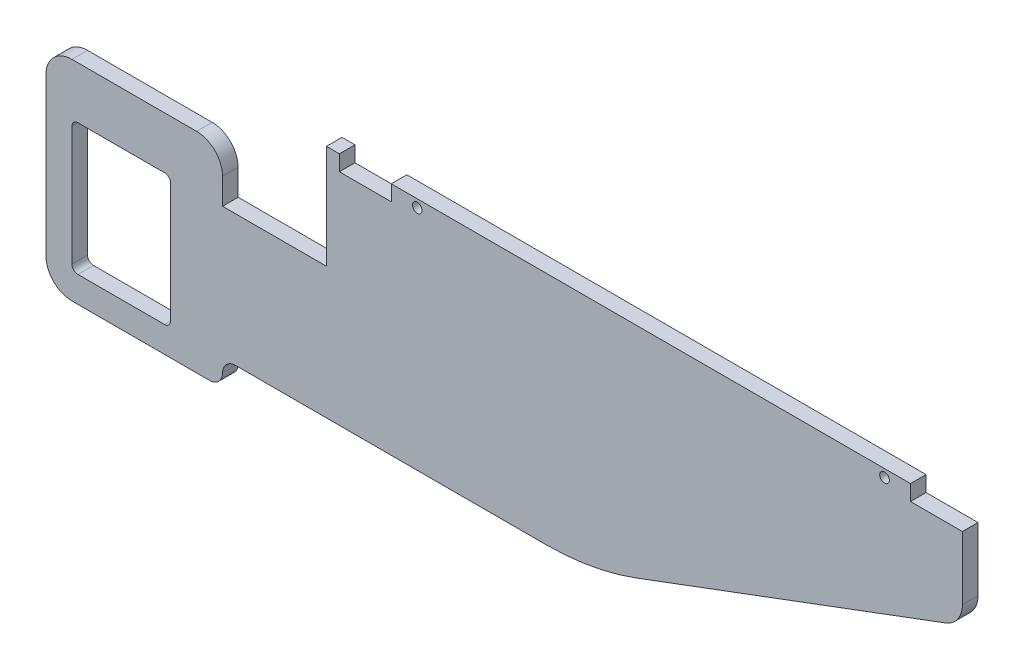
ISO-10303-21;
HEADER;
FILE_DESCRIPTION(('STEP AP214'),'2;1');
FILE_NAME('part.step','',(''),(''),'','','');
FILE_SCHEMA(('AUTOMOTIVE_DESIGN { 1 0 10303 214 1 1 1 1 }'));
ENDSEC;
DATA;
#1=APPLICATION_CONTEXT('core data for automotive mechanical design processes');
#2=APPLICATION_PROTOCOL_DEFINITION('international standard','automotive_design',2000,#1);
#3=PRODUCT_CONTEXT('',#1,'mechanical');
#4=PRODUCT('Part','Part','',(#3));
#5=PRODUCT_RELATED_PRODUCT_CATEGORY('part','',(#4));
#6=PRODUCT_DEFINITION_FORMATION('','',#4);
#7=PRODUCT_DEFINITION_CONTEXT('part definition',#1,'design');
#8=PRODUCT_DEFINITION('design','',#6,#7);
#9=PRODUCT_DEFINITION_SHAPE('','',#8);
#10=(LENGTH_UNIT() NAMED_UNIT(*) SI_UNIT(.MILLI.,.METRE.));
#11=(NAMED_UNIT(*) PLANE_ANGLE_UNIT() SI_UNIT($,.RADIAN.));
#12=(NAMED_UNIT(*) SI_UNIT($,.STERADIAN.) SOLID_ANGLE_UNIT());
#13=UNCERTAINTY_MEASURE_WITH_UNIT(LENGTH_MEASURE(1.E-05),#10,'distance_accuracy_value','');
#14=(GEOMETRIC_REPRESENTATION_CONTEXT(3) GLOBAL_UNCERTAINTY_ASSIGNED_CONTEXT((#13)) GLOBAL_UNIT_ASSIGNED_CONTEXT((#10,
#11,#12)) REPRESENTATION_CONTEXT('',''));
#15=CARTESIAN_POINT('',(0.,0.,0.));
#16=DIRECTION('',(0.,0.,1.));
#17=DIRECTION('',(1.,0.,0.));
#18=AXIS2_PLACEMENT_3D('',#15,#16,#17);
#19=CARTESIAN_POINT('',(323.,84.6,6.));
#20=DIRECTION('',(0.,0.,-1.));
#21=DIRECTION('',(-1.,0.,0.));
#22=AXIS2_PLACEMENT_3D('',#19,#20,#21);
#23=PLANE('',#22);
#24=CARTESIAN_POINT('',(133.,87.6,6.));
#25=DIRECTION('',(0.,0.,1.));
#26=DIRECTION('',(1.,0.,0.));
#27=AXIS2_PLACEMENT_3D('',#24,#25,#26);
#28=CIRCLE('',#27,1.85999999999999);
#29=CARTESIAN_POINT('',(134.86,87.6,6.));
#30=VERTEX_POINT('',#29);
#31=EDGE_CURVE('E306',#30,#30,#28,.T.);
#32=ORIENTED_EDGE('',*,*,#31,.F.);
#33=EDGE_LOOP('',(#32));
#34=FACE_BOUND('',#33,.T.);
#35=DIRECTION('',(1.,0.,0.));
#36=VECTOR('',#35,1.);
#37=CARTESIAN_POINT('',(58.,0.,6.));
#38=LINE('',#37,#36);
#39=CARTESIAN_POINT('',(63.,0.,6.));
#40=VERTEX_POINT('',#39);
#41=CARTESIAN_POINT('',(182.508323938548,0.,6.));
#42=VERTEX_POINT('',#41);
#43=EDGE_CURVE('E348',#40,#42,#38,.T.);
#44=ORIENTED_EDGE('',*,*,#43,.T.);
#45=CARTESIAN_POINT('',(182.508323938548,100.,6.));
#46=DIRECTION('',(0.,0.,-1.));
#47=DIRECTION('',(-1.,0.,0.));
#48=AXIS2_PLACEMENT_3D('',#45,#46,#47);
#49=CIRCLE('',#48,100.);
#50=CARTESIAN_POINT('',(217.544898349511,6.33870354546107,6.));
#51=VERTEX_POINT('',#50);
#52=EDGE_CURVE('E11',#42,#51,#49,.F.);
#53=ORIENTED_EDGE('',*,*,#52,.T.);
#54=DIRECTION('',(0.93661296454539,0.350365744109633,0.));
#55=VECTOR('',#54,1.);
#56=CARTESIAN_POINT('',(200.6,0.,6.));
#57=LINE('',#56,#55);
#58=CARTESIAN_POINT('',(336.503657441096,50.8384870475096,6.));
#59=VERTEX_POINT('',#58);
#60=EDGE_CURVE('E350',#51,#59,#57,.T.);
#61=ORIENTED_EDGE('',*,*,#60,.T.);
#62=CARTESIAN_POINT('',(333.,60.2046166929635,6.));
#63=DIRECTION('',(0.,0.,-1.));
#64=DIRECTION('',(-1.,0.,0.));
#65=AXIS2_PLACEMENT_3D('',#62,#63,#64);
#66=CIRCLE('',#65,10.);
#67=CARTESIAN_POINT('',(343.,60.2046166929635,6.));
#68=VERTEX_POINT('',#67);
#69=EDGE_CURVE('E443',#59,#68,#66,.F.);
#70=ORIENTED_EDGE('',*,*,#69,.T.);
#71=DIRECTION('',(0.,1.,0.));
#72=VECTOR('',#71,1.);
#73=CARTESIAN_POINT('',(343.,84.5999999999999,6.));
#74=LINE('',#73,#72);
#75=CARTESIAN_POINT('',(343.,84.5999999999999,6.));
#76=VERTEX_POINT('',#75);
#77=EDGE_CURVE('E352',#68,#76,#74,.T.);
#78=ORIENTED_EDGE('',*,*,#77,.T.);
#79=DIRECTION('',(-1.,0.,0.));
#80=VECTOR('',#79,1.);
#81=CARTESIAN_POINT('',(343.,84.5999999999999,6.));
#82=LINE('',#81,#80);
#83=CARTESIAN_POINT('',(323.,84.6,6.));
#84=VERTEX_POINT('',#83);
#85=EDGE_CURVE('E354',#76,#84,#82,.T.);
#86=ORIENTED_EDGE('',*,*,#85,.T.);
#87=DIRECTION('',(0.,1.,0.));
#88=VECTOR('',#87,1.);
#89=CARTESIAN_POINT('',(323.,90.6,6.));
#90=LINE('',#89,#88);
#91=CARTESIAN_POINT('',(323.,90.6,6.));
#92=VERTEX_POINT('',#91);
#93=EDGE_CURVE('E318',#84,#92,#90,.T.);
#94=ORIENTED_EDGE('',*,*,#93,.T.);
#95=DIRECTION('',(-1.,0.,0.));
#96=VECTOR('',#95,1.);
#97=CARTESIAN_POINT('',(123.,90.6,6.));
#98=LINE('',#97,#96);
#99=CARTESIAN_POINT('',(123.,90.6,6.));
#100=VERTEX_POINT('',#99);
#101=EDGE_CURVE('E321',#92,#100,#98,.T.);
#102=ORIENTED_EDGE('',*,*,#101,.T.);
#103=DIRECTION('',(0.,-1.,0.));
#104=VECTOR('',#103,1.);
#105=CARTESIAN_POINT('',(123.,90.6,6.));
#106=LINE('',#105,#104);
#107=CARTESIAN_POINT('',(123.,84.5999999999999,6.));
#108=VERTEX_POINT('',#107);
#109=EDGE_CURVE('E324',#100,#108,#106,.T.);
#110=ORIENTED_EDGE('',*,*,#109,.T.);
#111=DIRECTION('',(-1.,0.,0.));
#112=VECTOR('',#111,1.);
#113=CARTESIAN_POINT('',(103.,84.5999999999999,6.));
#114=LINE('',#113,#112);
#115=CARTESIAN_POINT('',(103.,84.5999999999999,6.));
#116=VERTEX_POINT('',#115);
#117=EDGE_CURVE('E326',#108,#116,#114,.T.);
#118=ORIENTED_EDGE('',*,*,#117,.T.);
#119=DIRECTION('',(0.,1.,0.));
#120=VECTOR('',#119,1.);
#121=CARTESIAN_POINT('',(103.,90.6,6.));
#122=LINE('',#121,#120);
#123=CARTESIAN_POINT('',(103.,90.6,6.));
#124=VERTEX_POINT('',#123);
#125=EDGE_CURVE('E328',#116,#124,#122,.T.);
#126=ORIENTED_EDGE('',*,*,#125,.T.);
#127=DIRECTION('',(-1.,0.,0.));
#128=VECTOR('',#127,1.);
#129=CARTESIAN_POINT('',(98.,90.6,6.));
#130=LINE('',#129,#128);
#131=CARTESIAN_POINT('',(98.,90.6,6.));
#132=VERTEX_POINT('',#131);
#133=EDGE_CURVE('E330',#124,#132,#130,.T.);
#134=ORIENTED_EDGE('',*,*,#133,.T.);
#135=DIRECTION('',(0.,-1.,0.));
#136=VECTOR('',#135,1.);
#137=CARTESIAN_POINT('',(98.,90.6,6.));
#138=LINE('',#137,#136);
#139=CARTESIAN_POINT('',(98.,50.6,6.));
#140=VERTEX_POINT('',#139);
#141=EDGE_CURVE('E332',#132,#140,#138,.T.);
#142=ORIENTED_EDGE('',*,*,#141,.T.);
#143=DIRECTION('',(-1.,0.,0.));
#144=VECTOR('',#143,1.);
#145=CARTESIAN_POINT('',(58.,50.6,6.));
#146=LINE('',#145,#144);
#147=CARTESIAN_POINT('',(58.,50.6,6.));
#148=VERTEX_POINT('',#147);
#149=EDGE_CURVE('E334',#140,#148,#146,.T.);
#150=ORIENTED_EDGE('',*,*,#149,.T.);
#151=DIRECTION('',(0.,1.,0.));
#152=VECTOR('',#151,1.);
#153=CARTESIAN_POINT('',(58.,58.4408840872774,6.));
#154=LINE('',#153,#152);
#155=CARTESIAN_POINT('',(58.,60.6,6.));
#156=VERTEX_POINT('',#155);
#157=EDGE_CURVE('E336',#148,#156,#154,.T.);
#158=ORIENTED_EDGE('',*,*,#157,.T.);
#159=CARTESIAN_POINT('',(48.,60.6,6.));
#160=DIRECTION('',(0.,0.,-1.));
#161=DIRECTION('',(-1.,0.,0.));
#162=AXIS2_PLACEMENT_3D('',#159,#160,#161);
#163=CIRCLE('',#162,10.);
#164=CARTESIAN_POINT('',(48.,70.6,6.));
#165=VERTEX_POINT('',#164);
#166=EDGE_CURVE('E437',#156,#165,#163,.F.);
#167=ORIENTED_EDGE('',*,*,#166,.T.);
#168=DIRECTION('',(-1.,0.,0.));
#169=VECTOR('',#168,1.);
#170=CARTESIAN_POINT('',(-10.,70.6,6.));
#171=LINE('',#170,#169);
#172=CARTESIAN_POINT('',(0.,70.6,6.));
#173=VERTEX_POINT('',#172);
#174=EDGE_CURVE('E339',#165,#173,#171,.T.);
#175=ORIENTED_EDGE('',*,*,#174,.T.);
#176=CARTESIAN_POINT('',(0.,60.6,6.));
#177=DIRECTION('',(0.,0.,-1.));
#178=DIRECTION('',(-1.,0.,0.));
#179=AXIS2_PLACEMENT_3D('',#176,#177,#178);
#180=CIRCLE('',#179,10.);
#181=CARTESIAN_POINT('',(-10.,60.6,6.));
#182=VERTEX_POINT('',#181);
#183=EDGE_CURVE('E441',#173,#182,#180,.F.);
#184=ORIENTED_EDGE('',*,*,#183,.T.);
#185=DIRECTION('',(0.,-1.,0.));
#186=VECTOR('',#185,1.);
#187=CARTESIAN_POINT('',(-10.,70.6,6.));
#188=LINE('',#187,#186);
#189=CARTESIAN_POINT('',(-9.99999999999999,0.,6.));
#190=VERTEX_POINT('',#189);
#191=EDGE_CURVE('E342',#182,#190,#188,.T.);
#192=ORIENTED_EDGE('',*,*,#191,.T.);
#193=CARTESIAN_POINT('',(0.,0.,6.));
#194=DIRECTION('',(0.,0.,-1.));
#195=DIRECTION('',(-1.,0.,0.));
#196=AXIS2_PLACEMENT_3D('',#193,#194,#195);
#197=CIRCLE('',#196,10.);
#198=CARTESIAN_POINT('',(0.,-10.,6.));
#199=VERTEX_POINT('',#198);
#200=EDGE_CURVE('E439',#190,#199,#197,.F.);
#201=ORIENTED_EDGE('',*,*,#200,.T.);
#202=DIRECTION('',(1.,0.,0.));
#203=VECTOR('',#202,1.);
#204=CARTESIAN_POINT('',(-9.99999999999999,-10.,6.));
#205=LINE('',#204,#203);
#206=CARTESIAN_POINT('',(53.,-10.,6.));
#207=VERTEX_POINT('',#206);
#208=EDGE_CURVE('E345',#199,#207,#205,.T.);
#209=ORIENTED_EDGE('',*,*,#208,.T.);
#210=CARTESIAN_POINT('',(53.,-5.,6.));
#211=DIRECTION('',(0.,0.,-1.));
#212=DIRECTION('',(-1.,0.,0.));
#213=AXIS2_PLACEMENT_3D('',#210,#211,#212);
#214=CIRCLE('',#213,5.);
#215=CARTESIAN_POINT('',(58.,-5.,6.));
#216=VERTEX_POINT('',#215);
#217=EDGE_CURVE('E467',#207,#216,#214,.F.);
#218=ORIENTED_EDGE('',*,*,#217,.T.);
#219=CARTESIAN_POINT('',(63.,-5.,6.));
#220=DIRECTION('',(0.,0.,-1.));
#221=DIRECTION('',(-1.,0.,0.));
#222=AXIS2_PLACEMENT_3D('',#219,#220,#221);
#223=CIRCLE('',#222,5.);
#224=EDGE_CURVE('E471',#216,#40,#223,.T.);
#225=ORIENTED_EDGE('',*,*,#224,.T.);
#226=EDGE_LOOP('',(#44,#53,#61,#70,#78,#86,#94,#102,#110,#118,#126,#134,#142,#150,#158,#167,
#175,#184,#192,#201,#209,#218,#225));
#227=FACE_BOUND('',#226,.T.);
#228=CARTESIAN_POINT('',(313.,87.6,6.));
#229=DIRECTION('',(0.,0.,1.));
#230=DIRECTION('',(1.,0.,0.));
#231=AXIS2_PLACEMENT_3D('',#228,#229,#230);
#232=CIRCLE('',#231,1.85999999999996);
#233=CARTESIAN_POINT('',(314.86,87.6,6.));
#234=VERTEX_POINT('',#233);
#235=EDGE_CURVE('E312',#234,#234,#232,.T.);
#236=ORIENTED_EDGE('',*,*,#235,.F.);
#237=EDGE_LOOP('',(#236));
#238=FACE_BOUND('',#237,.T.);
#239=CARTESIAN_POINT('',(2.3,48.3,6.));
#240=DIRECTION('',(0.,0.,1.));
#241=DIRECTION('',(1.,0.,0.));
#242=AXIS2_PLACEMENT_3D('',#239,#240,#241);
#243=CIRCLE('',#242,2.3);
#244=CARTESIAN_POINT('',(2.3,50.6,6.));
#245=VERTEX_POINT('',#244);
#246=CARTESIAN_POINT('',(0.,48.3,6.));
#247=VERTEX_POINT('',#246);
#248=EDGE_CURVE('E235',#245,#247,#243,.T.);
#249=ORIENTED_EDGE('',*,*,#248,.F.);
#250=DIRECTION('',(-1.,0.,0.));
#251=VECTOR('',#250,1.);
#252=CARTESIAN_POINT('',(2.3,50.6,6.));
#253=LINE('',#252,#251);
#254=CARTESIAN_POINT('',(35.7,50.6,6.));
#255=VERTEX_POINT('',#254);
#256=EDGE_CURVE('E271',#255,#245,#253,.T.);
#257=ORIENTED_EDGE('',*,*,#256,.F.);
#258=CARTESIAN_POINT('',(35.7,48.3,6.));
#259=DIRECTION('',(0.,0.,1.));
#260=DIRECTION('',(-1.,0.,0.));
#261=AXIS2_PLACEMENT_3D('',#258,#259,#260);
#262=CIRCLE('',#261,2.3);
#263=CARTESIAN_POINT('',(38.,48.3,6.));
#264=VERTEX_POINT('',#263);
#265=EDGE_CURVE('E268',#264,#255,#262,.T.);
#266=ORIENTED_EDGE('',*,*,#265,.F.);
#267=DIRECTION('',(0.,1.,0.));
#268=VECTOR('',#267,1.);
#269=CARTESIAN_POINT('',(38.,48.3,6.));
#270=LINE('',#269,#268);
#271=CARTESIAN_POINT('',(38.,2.3,6.));
#272=VERTEX_POINT('',#271);
#273=EDGE_CURVE('E266',#272,#264,#270,.T.);
#274=ORIENTED_EDGE('',*,*,#273,.F.);
#275=CARTESIAN_POINT('',(35.7,2.3,6.));
#276=DIRECTION('',(0.,0.,1.));
#277=DIRECTION('',(-1.,0.,0.));
#278=AXIS2_PLACEMENT_3D('',#275,#276,#277);
#279=CIRCLE('',#278,2.3);
#280=CARTESIAN_POINT('',(35.7,0.,6.));
#281=VERTEX_POINT('',#280);
#282=EDGE_CURVE('E264',#281,#272,#279,.T.);
#283=ORIENTED_EDGE('',*,*,#282,.F.);
#284=DIRECTION('',(1.,0.,0.));
#285=VECTOR('',#284,1.);
#286=CARTESIAN_POINT('',(2.30000000000001,0.,6.));
#287=LINE('',#286,#285);
#288=CARTESIAN_POINT('',(2.30000000000001,0.,6.));
#289=VERTEX_POINT('',#288);
#290=EDGE_CURVE('E260',#289,#281,#287,.T.);
#291=ORIENTED_EDGE('',*,*,#290,.F.);
#292=CARTESIAN_POINT('',(2.30000000000001,2.3,6.));
#293=DIRECTION('',(0.,0.,1.));
#294=DIRECTION('',(1.,0.,0.));
#295=AXIS2_PLACEMENT_3D('',#292,#293,#294);
#296=CIRCLE('',#295,2.3);
#297=CARTESIAN_POINT('',(0.,2.3,6.));
#298=VERTEX_POINT('',#297);
#299=EDGE_CURVE('E258',#298,#289,#296,.T.);
#300=ORIENTED_EDGE('',*,*,#299,.F.);
#301=DIRECTION('',(0.,-1.,0.));
#302=VECTOR('',#301,1.);
#303=CARTESIAN_POINT('',(0.,48.3,6.));
#304=LINE('',#303,#302);
#305=EDGE_CURVE('E245',#247,#298,#304,.T.);
#306=ORIENTED_EDGE('',*,*,#305,.F.);
#307=EDGE_LOOP('',(#249,#257,#266,#274,#283,#291,#300,#306));
#308=FACE_BOUND('',#307,.T.);
#309=ADVANCED_FACE('F31',(#34,#227,#238,#308),#23,.F.);
#310=CARTESIAN_POINT('',(323.,84.6,0.));
#311=DIRECTION('',(0.,0.,-1.));
#312=DIRECTION('',(-1.,0.,0.));
#313=AXIS2_PLACEMENT_3D('',#310,#311,#312);
#314=PLANE('',#313);
#315=CARTESIAN_POINT('',(133.,87.6,0.));
#316=DIRECTION('',(0.,0.,1.));
#317=DIRECTION('',(1.,0.,0.));
#318=AXIS2_PLACEMENT_3D('',#315,#316,#317);
#319=CIRCLE('',#318,1.85999999999999);
#320=CARTESIAN_POINT('',(134.86,87.6,0.));
#321=VERTEX_POINT('',#320);
#322=EDGE_CURVE('E253',#321,#321,#319,.T.);
#323=ORIENTED_EDGE('',*,*,#322,.T.);
#324=EDGE_LOOP('',(#323));
#325=FACE_BOUND('',#324,.T.);
#326=DIRECTION('',(0.93661296454539,0.350365744109633,0.));
#327=VECTOR('',#326,1.);
#328=CARTESIAN_POINT('',(200.6,0.,0.));
#329=LINE('',#328,#327);
#330=CARTESIAN_POINT('',(217.544898349511,6.33870354546107,0.));
#331=VERTEX_POINT('',#330);
#332=CARTESIAN_POINT('',(336.503657441096,50.8384870475096,0.));
#333=VERTEX_POINT('',#332);
#334=EDGE_CURVE('E388',#331,#333,#329,.T.);
#335=ORIENTED_EDGE('',*,*,#334,.F.);
#336=CARTESIAN_POINT('',(182.508323938548,100.,0.));
#337=DIRECTION('',(0.,0.,-1.));
#338=DIRECTION('',(-1.,0.,0.));
#339=AXIS2_PLACEMENT_3D('',#336,#337,#338);
#340=CIRCLE('',#339,100.);
#341=CARTESIAN_POINT('',(182.508323938548,0.,0.));
#342=VERTEX_POINT('',#341);
#343=EDGE_CURVE('E53',#331,#342,#340,.T.);
#344=ORIENTED_EDGE('',*,*,#343,.T.);
#345=DIRECTION('',(1.,0.,0.));
#346=VECTOR('',#345,1.);
#347=CARTESIAN_POINT('',(58.,0.,0.));
#348=LINE('',#347,#346);
#349=CARTESIAN_POINT('',(63.,0.,0.));
#350=VERTEX_POINT('',#349);
#351=EDGE_CURVE('E386',#350,#342,#348,.T.);
#352=ORIENTED_EDGE('',*,*,#351,.F.);
#353=CARTESIAN_POINT('',(63.,-5.,0.));
#354=DIRECTION('',(0.,0.,-1.));
#355=DIRECTION('',(-1.,0.,0.));
#356=AXIS2_PLACEMENT_3D('',#353,#354,#355);
#357=CIRCLE('',#356,5.);
#358=CARTESIAN_POINT('',(58.,-5.,0.));
#359=VERTEX_POINT('',#358);
#360=EDGE_CURVE('E469',#350,#359,#357,.F.);
#361=ORIENTED_EDGE('',*,*,#360,.T.);
#362=CARTESIAN_POINT('',(53.,-5.,0.));
#363=DIRECTION('',(0.,0.,-1.));
#364=DIRECTION('',(-1.,0.,0.));
#365=AXIS2_PLACEMENT_3D('',#362,#363,#364);
#366=CIRCLE('',#365,5.);
#367=CARTESIAN_POINT('',(53.,-10.,0.));
#368=VERTEX_POINT('',#367);
#369=EDGE_CURVE('E463',#359,#368,#366,.T.);
#370=ORIENTED_EDGE('',*,*,#369,.T.);
#371=DIRECTION('',(1.,0.,0.));
#372=VECTOR('',#371,1.);
#373=CARTESIAN_POINT('',(-9.99999999999999,-10.,0.));
#374=LINE('',#373,#372);
#375=CARTESIAN_POINT('',(0.,-10.,0.));
#376=VERTEX_POINT('',#375);
#377=EDGE_CURVE('E383',#376,#368,#374,.T.);
#378=ORIENTED_EDGE('',*,*,#377,.F.);
#379=CARTESIAN_POINT('',(0.,0.,0.));
#380=DIRECTION('',(0.,0.,-1.));
#381=DIRECTION('',(-1.,0.,0.));
#382=AXIS2_PLACEMENT_3D('',#379,#380,#381);
#383=CIRCLE('',#382,10.);
#384=CARTESIAN_POINT('',(-9.99999999999999,0.,0.));
#385=VERTEX_POINT('',#384);
#386=EDGE_CURVE('E427',#376,#385,#383,.T.);
#387=ORIENTED_EDGE('',*,*,#386,.T.);
#388=DIRECTION('',(0.,-1.,0.));
#389=VECTOR('',#388,1.);
#390=CARTESIAN_POINT('',(-10.,70.6,0.));
#391=LINE('',#390,#389);
#392=CARTESIAN_POINT('',(-10.,60.6,0.));
#393=VERTEX_POINT('',#392);
#394=EDGE_CURVE('E380',#393,#385,#391,.T.);
#395=ORIENTED_EDGE('',*,*,#394,.F.);
#396=CARTESIAN_POINT('',(0.,60.6,0.));
#397=DIRECTION('',(0.,0.,-1.));
#398=DIRECTION('',(-1.,0.,0.));
#399=AXIS2_PLACEMENT_3D('',#396,#397,#398);
#400=CIRCLE('',#399,10.);
#401=CARTESIAN_POINT('',(0.,70.6,0.));
#402=VERTEX_POINT('',#401);
#403=EDGE_CURVE('E429',#393,#402,#400,.T.);
#404=ORIENTED_EDGE('',*,*,#403,.T.);
#405=DIRECTION('',(-1.,0.,0.));
#406=VECTOR('',#405,1.);
#407=CARTESIAN_POINT('',(-10.,70.6,0.));
#408=LINE('',#407,#406);
#409=CARTESIAN_POINT('',(48.,70.6,0.));
#410=VERTEX_POINT('',#409);
#411=EDGE_CURVE('E377',#410,#402,#408,.T.);
#412=ORIENTED_EDGE('',*,*,#411,.F.);
#413=CARTESIAN_POINT('',(48.,60.6,0.));
#414=DIRECTION('',(0.,0.,-1.));
#415=DIRECTION('',(-1.,0.,0.));
#416=AXIS2_PLACEMENT_3D('',#413,#414,#415);
#417=CIRCLE('',#416,10.);
#418=CARTESIAN_POINT('',(58.,60.6,0.));
#419=VERTEX_POINT('',#418);
#420=EDGE_CURVE('E425',#410,#419,#417,.T.);
#421=ORIENTED_EDGE('',*,*,#420,.T.);
#422=DIRECTION('',(0.,1.,0.));
#423=VECTOR('',#422,1.);
#424=CARTESIAN_POINT('',(58.,70.6,0.));
#425=LINE('',#424,#423);
#426=CARTESIAN_POINT('',(58.,50.6,0.));
#427=VERTEX_POINT('',#426);
#428=EDGE_CURVE('E374',#427,#419,#425,.T.);
#429=ORIENTED_EDGE('',*,*,#428,.F.);
#430=DIRECTION('',(-1.,0.,0.));
#431=VECTOR('',#430,1.);
#432=CARTESIAN_POINT('',(58.,50.6,0.));
#433=LINE('',#432,#431);
#434=CARTESIAN_POINT('',(98.,50.6,0.));
#435=VERTEX_POINT('',#434);
#436=EDGE_CURVE('E371',#435,#427,#433,.T.);
#437=ORIENTED_EDGE('',*,*,#436,.F.);
#438=DIRECTION('',(0.,-1.,0.));
#439=VECTOR('',#438,1.);
#440=CARTESIAN_POINT('',(98.,90.6,0.));
#441=LINE('',#440,#439);
#442=CARTESIAN_POINT('',(98.,90.6,0.));
#443=VERTEX_POINT('',#442);
#444=EDGE_CURVE('E369',#443,#435,#441,.T.);
#445=ORIENTED_EDGE('',*,*,#444,.F.);
#446=DIRECTION('',(-1.,0.,0.));
#447=VECTOR('',#446,1.);
#448=CARTESIAN_POINT('',(98.,90.6,0.));
#449=LINE('',#448,#447);
#450=CARTESIAN_POINT('',(103.,90.6,0.));
#451=VERTEX_POINT('',#450);
#452=EDGE_CURVE('E367',#451,#443,#449,.T.);
#453=ORIENTED_EDGE('',*,*,#452,.F.);
#454=DIRECTION('',(0.,1.,0.));
#455=VECTOR('',#454,1.);
#456=CARTESIAN_POINT('',(103.,90.6,0.));
#457=LINE('',#456,#455);
#458=CARTESIAN_POINT('',(103.,84.5999999999999,0.));
#459=VERTEX_POINT('',#458);
#460=EDGE_CURVE('E365',#459,#451,#457,.T.);
#461=ORIENTED_EDGE('',*,*,#460,.F.);
#462=DIRECTION('',(-1.,0.,0.));
#463=VECTOR('',#462,1.);
#464=CARTESIAN_POINT('',(103.,84.5999999999999,0.));
#465=LINE('',#464,#463);
#466=CARTESIAN_POINT('',(123.,84.5999999999999,0.));
#467=VERTEX_POINT('',#466);
#468=EDGE_CURVE('E363',#467,#459,#465,.T.);
#469=ORIENTED_EDGE('',*,*,#468,.F.);
#470=DIRECTION('',(0.,-1.,0.));
#471=VECTOR('',#470,1.);
#472=CARTESIAN_POINT('',(123.,90.6,0.));
#473=LINE('',#472,#471);
#474=CARTESIAN_POINT('',(123.,90.6,0.));
#475=VERTEX_POINT('',#474);
#476=EDGE_CURVE('E361',#475,#467,#473,.T.);
#477=ORIENTED_EDGE('',*,*,#476,.F.);
#478=DIRECTION('',(-1.,0.,0.));
#479=VECTOR('',#478,1.);
#480=CARTESIAN_POINT('',(123.,90.6,0.));
#481=LINE('',#480,#479);
#482=CARTESIAN_POINT('',(323.,90.6,0.));
#483=VERTEX_POINT('',#482);
#484=EDGE_CURVE('E359',#483,#475,#481,.T.);
#485=ORIENTED_EDGE('',*,*,#484,.F.);
#486=DIRECTION('',(0.,1.,0.));
#487=VECTOR('',#486,1.);
#488=CARTESIAN_POINT('',(323.,90.6,0.));
#489=LINE('',#488,#487);
#490=CARTESIAN_POINT('',(323.,84.6,0.));
#491=VERTEX_POINT('',#490);
#492=EDGE_CURVE('E315',#491,#483,#489,.T.);
#493=ORIENTED_EDGE('',*,*,#492,.F.);
#494=DIRECTION('',(-1.,0.,0.));
#495=VECTOR('',#494,1.);
#496=CARTESIAN_POINT('',(343.,84.5999999999999,0.));
#497=LINE('',#496,#495);
#498=CARTESIAN_POINT('',(343.,84.5999999999999,0.));
#499=VERTEX_POINT('',#498);
#500=EDGE_CURVE('E322',#499,#491,#497,.T.);
#501=ORIENTED_EDGE('',*,*,#500,.F.);
#502=DIRECTION('',(0.,1.,0.));
#503=VECTOR('',#502,1.);
#504=CARTESIAN_POINT('',(343.,84.5999999999999,0.));
#505=LINE('',#504,#503);
#506=CARTESIAN_POINT('',(343.,60.2046166929635,0.));
#507=VERTEX_POINT('',#506);
#508=EDGE_CURVE('E390',#507,#499,#505,.T.);
#509=ORIENTED_EDGE('',*,*,#508,.F.);
#510=CARTESIAN_POINT('',(333.,60.2046166929635,0.));
#511=DIRECTION('',(0.,0.,-1.));
#512=DIRECTION('',(-1.,0.,0.));
#513=AXIS2_PLACEMENT_3D('',#510,#511,#512);
#514=CIRCLE('',#513,10.);
#515=EDGE_CURVE('E431',#507,#333,#514,.T.);
#516=ORIENTED_EDGE('',*,*,#515,.T.);
#517=EDGE_LOOP('',(#335,#344,#352,#361,#370,#378,#387,#395,#404,#412,#421,#429,#437,#445,#453,
#461,#469,#477,#485,#493,#501,#509,#516));
#518=FACE_BOUND('',#517,.T.);
#519=CARTESIAN_POINT('',(313.,87.6,0.));
#520=DIRECTION('',(0.,0.,1.));
#521=DIRECTION('',(1.,0.,0.));
#522=AXIS2_PLACEMENT_3D('',#519,#520,#521);
#523=CIRCLE('',#522,1.85999999999996);
#524=CARTESIAN_POINT('',(314.86,87.6,0.));
#525=VERTEX_POINT('',#524);
#526=EDGE_CURVE('E309',#525,#525,#523,.T.);
#527=ORIENTED_EDGE('',*,*,#526,.T.);
#528=EDGE_LOOP('',(#527));
#529=FACE_BOUND('',#528,.T.);
#530=DIRECTION('',(-1.,0.,0.));
#531=VECTOR('',#530,1.);
#532=CARTESIAN_POINT('',(2.3,50.6,0.));
#533=LINE('',#532,#531);
#534=CARTESIAN_POINT('',(35.7,50.6,0.));
#535=VERTEX_POINT('',#534);
#536=CARTESIAN_POINT('',(2.29999999999997,50.6,0.));
#537=VERTEX_POINT('',#536);
#538=EDGE_CURVE('E246',#535,#537,#533,.T.);
#539=ORIENTED_EDGE('',*,*,#538,.T.);
#540=CARTESIAN_POINT('',(2.3,48.3,0.));
#541=DIRECTION('',(0.,0.,1.));
#542=DIRECTION('',(1.,0.,0.));
#543=AXIS2_PLACEMENT_3D('',#540,#541,#542);
#544=CIRCLE('',#543,2.3);
#545=CARTESIAN_POINT('',(0.,48.3,0.));
#546=VERTEX_POINT('',#545);
#547=EDGE_CURVE('E273',#537,#546,#544,.T.);
#548=ORIENTED_EDGE('',*,*,#547,.T.);
#549=DIRECTION('',(0.,-1.,0.));
#550=VECTOR('',#549,1.);
#551=CARTESIAN_POINT('',(0.,48.3,0.));
#552=LINE('',#551,#550);
#553=CARTESIAN_POINT('',(0.,2.3,0.));
#554=VERTEX_POINT('',#553);
#555=EDGE_CURVE('E252',#546,#554,#552,.T.);
#556=ORIENTED_EDGE('',*,*,#555,.T.);
#557=CARTESIAN_POINT('',(2.30000000000001,2.3,0.));
#558=DIRECTION('',(0.,0.,1.));
#559=DIRECTION('',(1.,0.,0.));
#560=AXIS2_PLACEMENT_3D('',#557,#558,#559);
#561=CIRCLE('',#560,2.3);
#562=CARTESIAN_POINT('',(2.30000000000001,0.,0.));
#563=VERTEX_POINT('',#562);
#564=EDGE_CURVE('E277',#554,#563,#561,.T.);
#565=ORIENTED_EDGE('',*,*,#564,.T.);
#566=DIRECTION('',(1.,0.,0.));
#567=VECTOR('',#566,1.);
#568=CARTESIAN_POINT('',(2.30000000000001,0.,0.));
#569=LINE('',#568,#567);
#570=CARTESIAN_POINT('',(35.7,0.,0.));
#571=VERTEX_POINT('',#570);
#572=EDGE_CURVE('E280',#563,#571,#569,.T.);
#573=ORIENTED_EDGE('',*,*,#572,.T.);
#574=CARTESIAN_POINT('',(35.7,2.3,0.));
#575=DIRECTION('',(0.,0.,1.));
#576=DIRECTION('',(-1.,0.,0.));
#577=AXIS2_PLACEMENT_3D('',#574,#575,#576);
#578=CIRCLE('',#577,2.3);
#579=CARTESIAN_POINT('',(38.,2.3,0.));
#580=VERTEX_POINT('',#579);
#581=EDGE_CURVE('E283',#571,#580,#578,.T.);
#582=ORIENTED_EDGE('',*,*,#581,.T.);
#583=DIRECTION('',(0.,1.,0.));
#584=VECTOR('',#583,1.);
#585=CARTESIAN_POINT('',(38.,48.3,0.));
#586=LINE('',#585,#584);
#587=CARTESIAN_POINT('',(38.,48.3,0.));
#588=VERTEX_POINT('',#587);
#589=EDGE_CURVE('E286',#580,#588,#586,.T.);
#590=ORIENTED_EDGE('',*,*,#589,.T.);
#591=CARTESIAN_POINT('',(35.7,48.3,0.));
#592=DIRECTION('',(0.,0.,1.));
#593=DIRECTION('',(-1.,0.,0.));
#594=AXIS2_PLACEMENT_3D('',#591,#592,#593);
#595=CIRCLE('',#594,2.3);
#596=EDGE_CURVE('E289',#588,#535,#595,.T.);
#597=ORIENTED_EDGE('',*,*,#596,.T.);
#598=EDGE_LOOP('',(#539,#548,#556,#565,#573,#582,#590,#597));
#599=FACE_BOUND('',#598,.T.);
#600=ADVANCED_FACE('F484',(#325,#518,#529,#599),#314,.T.);
#601=CARTESIAN_POINT('',(323.,90.6,6.));
#602=DIRECTION('',(-1.,0.,0.));
#603=DIRECTION('',(0.,-1.,0.));
#604=AXIS2_PLACEMENT_3D('',#601,#602,#603);
#605=PLANE('',#604);
#606=ORIENTED_EDGE('',*,*,#492,.T.);
#607=DIRECTION('',(0.,0.,-1.));
#608=VECTOR('',#607,1.);
#609=CARTESIAN_POINT('',(323.,90.6,6.));
#610=LINE('',#609,#608);
#611=EDGE_CURVE('E419',#92,#483,#610,.T.);
#612=ORIENTED_EDGE('',*,*,#611,.F.);
#613=ORIENTED_EDGE('',*,*,#93,.F.);
#614=DIRECTION('',(0.,0.,-1.));
#615=VECTOR('',#614,1.);
#616=CARTESIAN_POINT('',(323.,84.6,6.));
#617=LINE('',#616,#615);
#618=EDGE_CURVE('E356',#84,#491,#617,.T.);
#619=ORIENTED_EDGE('',*,*,#618,.T.);
#620=EDGE_LOOP('',(#606,#612,#613,#619));
#621=FACE_BOUND('',#620,.T.);
#622=ADVANCED_FACE('F507',(#621),#605,.F.);
#623=CARTESIAN_POINT('',(123.,90.6,6.));
#624=DIRECTION('',(0.,-1.,0.));
#625=DIRECTION('',(0.,0.,-1.));
#626=AXIS2_PLACEMENT_3D('',#623,#624,#625);
#627=PLANE('',#626);
#628=ORIENTED_EDGE('',*,*,#484,.T.);
#629=DIRECTION('',(0.,0.,-1.));
#630=VECTOR('',#629,1.);
#631=CARTESIAN_POINT('',(123.,90.6,6.));
#632=LINE('',#631,#630);
#633=EDGE_CURVE('E416',#100,#475,#632,.T.);
#634=ORIENTED_EDGE('',*,*,#633,.F.);
#635=ORIENTED_EDGE('',*,*,#101,.F.);
#636=ORIENTED_EDGE('',*,*,#611,.T.);
#637=EDGE_LOOP('',(#628,#634,#635,#636));
#638=FACE_BOUND('',#637,.T.);
#639=ADVANCED_FACE('F510',(#638),#627,.F.);
#640=CARTESIAN_POINT('',(123.,90.6,6.));
#641=DIRECTION('',(1.,0.,0.));
#642=DIRECTION('',(0.,0.,-1.));
#643=AXIS2_PLACEMENT_3D('',#640,#641,#642);
#644=PLANE('',#643);
#645=ORIENTED_EDGE('',*,*,#476,.T.);
#646=DIRECTION('',(0.,0.,-1.));
#647=VECTOR('',#646,1.);
#648=CARTESIAN_POINT('',(123.,84.5999999999999,6.));
#649=LINE('',#648,#647);
#650=EDGE_CURVE('E413',#108,#467,#649,.T.);
#651=ORIENTED_EDGE('',*,*,#650,.F.);
#652=ORIENTED_EDGE('',*,*,#109,.F.);
#653=ORIENTED_EDGE('',*,*,#633,.T.);
#654=EDGE_LOOP('',(#645,#651,#652,#653));
#655=FACE_BOUND('',#654,.T.);
#656=ADVANCED_FACE('F515',(#655),#644,.F.);
#657=CARTESIAN_POINT('',(103.,84.5999999999999,6.));
#658=DIRECTION('',(0.,-1.,0.));
#659=DIRECTION('',(0.,0.,-1.));
#660=AXIS2_PLACEMENT_3D('',#657,#658,#659);
#661=PLANE('',#660);
#662=ORIENTED_EDGE('',*,*,#468,.T.);
#663=DIRECTION('',(0.,0.,-1.));
#664=VECTOR('',#663,1.);
#665=CARTESIAN_POINT('',(103.,84.5999999999999,6.));
#666=LINE('',#665,#664);
#667=EDGE_CURVE('E410',#116,#459,#666,.T.);
#668=ORIENTED_EDGE('',*,*,#667,.F.);
#669=ORIENTED_EDGE('',*,*,#117,.F.);
#670=ORIENTED_EDGE('',*,*,#650,.T.);
#671=EDGE_LOOP('',(#662,#668,#669,#670));
#672=FACE_BOUND('',#671,.T.);
#673=ADVANCED_FACE('F521',(#672),#661,.F.);
#674=CARTESIAN_POINT('',(103.,90.6,6.));
#675=DIRECTION('',(-1.,0.,0.));
#676=DIRECTION('',(0.,0.,1.));
#677=AXIS2_PLACEMENT_3D('',#674,#675,#676);
#678=PLANE('',#677);
#679=ORIENTED_EDGE('',*,*,#460,.T.);
#680=DIRECTION('',(0.,0.,-1.));
#681=VECTOR('',#680,1.);
#682=CARTESIAN_POINT('',(103.,90.6,6.));
#683=LINE('',#682,#681);
#684=EDGE_CURVE('E407',#124,#451,#683,.T.);
#685=ORIENTED_EDGE('',*,*,#684,.F.);
#686=ORIENTED_EDGE('',*,*,#125,.F.);
#687=ORIENTED_EDGE('',*,*,#667,.T.);
#688=EDGE_LOOP('',(#679,#685,#686,#687));
#689=FACE_BOUND('',#688,.T.);
#690=ADVANCED_FACE('F525',(#689),#678,.F.);
#691=CARTESIAN_POINT('',(98.,90.6,6.));
#692=DIRECTION('',(0.,-1.,0.));
#693=DIRECTION('',(0.,0.,-1.));
#694=AXIS2_PLACEMENT_3D('',#691,#692,#693);
#695=PLANE('',#694);
#696=ORIENTED_EDGE('',*,*,#452,.T.);
#697=DIRECTION('',(0.,0.,-1.));
#698=VECTOR('',#697,1.);
#699=CARTESIAN_POINT('',(98.,90.6,6.));
#700=LINE('',#699,#698);
#701=EDGE_CURVE('E404',#132,#443,#700,.T.);
#702=ORIENTED_EDGE('',*,*,#701,.F.);
#703=ORIENTED_EDGE('',*,*,#133,.F.);
#704=ORIENTED_EDGE('',*,*,#684,.T.);
#705=EDGE_LOOP('',(#696,#702,#703,#704));
#706=FACE_BOUND('',#705,.T.);
#707=ADVANCED_FACE('F530',(#706),#695,.F.);
#708=CARTESIAN_POINT('',(98.,90.6,6.));
#709=DIRECTION('',(1.,0.,0.));
#710=DIRECTION('',(0.,1.,0.));
#711=AXIS2_PLACEMENT_3D('',#708,#709,#710);
#712=PLANE('',#711);
#713=ORIENTED_EDGE('',*,*,#444,.T.);
#714=DIRECTION('',(0.,0.,-1.));
#715=VECTOR('',#714,1.);
#716=CARTESIAN_POINT('',(98.,50.6,6.));
#717=LINE('',#716,#715);
#718=EDGE_CURVE('E401',#140,#435,#717,.T.);
#719=ORIENTED_EDGE('',*,*,#718,.F.);
#720=ORIENTED_EDGE('',*,*,#141,.F.);
#721=ORIENTED_EDGE('',*,*,#701,.T.);
#722=EDGE_LOOP('',(#713,#719,#720,#721));
#723=FACE_BOUND('',#722,.T.);
#724=ADVANCED_FACE('F536',(#723),#712,.F.);
#725=CARTESIAN_POINT('',(58.,50.6,6.));
#726=DIRECTION('',(0.,-1.,0.));
#727=DIRECTION('',(1.,0.,0.));
#728=AXIS2_PLACEMENT_3D('',#725,#726,#727);
#729=PLANE('',#728);
#730=ORIENTED_EDGE('',*,*,#436,.T.);
#731=DIRECTION('',(0.,0.,-1.));
#732=VECTOR('',#731,1.);
#733=CARTESIAN_POINT('',(58.,50.6,6.));
#734=LINE('',#733,#732);
#735=EDGE_CURVE('E398',#148,#427,#734,.T.);
#736=ORIENTED_EDGE('',*,*,#735,.F.);
#737=ORIENTED_EDGE('',*,*,#149,.F.);
#738=ORIENTED_EDGE('',*,*,#718,.T.);
#739=EDGE_LOOP('',(#730,#736,#737,#738));
#740=FACE_BOUND('',#739,.T.);
#741=ADVANCED_FACE('F540',(#740),#729,.F.);
#742=CARTESIAN_POINT('',(58.,70.6,6.));
#743=DIRECTION('',(-1.,0.,0.));
#744=DIRECTION('',(0.,0.,1.));
#745=AXIS2_PLACEMENT_3D('',#742,#743,#744);
#746=PLANE('',#745);
#747=ORIENTED_EDGE('',*,*,#428,.T.);
#748=DIRECTION('',(0.,0.,-1.));
#749=VECTOR('',#748,1.);
#750=CARTESIAN_POINT('',(58.,60.6,6.));
#751=LINE('',#750,#749);
#752=EDGE_CURVE('E458',#419,#156,#751,.F.);
#753=ORIENTED_EDGE('',*,*,#752,.T.);
#754=ORIENTED_EDGE('',*,*,#157,.F.);
#755=ORIENTED_EDGE('',*,*,#735,.T.);
#756=EDGE_LOOP('',(#747,#753,#754,#755));
#757=FACE_BOUND('',#756,.T.);
#758=ADVANCED_FACE('F543',(#757),#746,.F.);
#759=CARTESIAN_POINT('',(-10.,70.6,6.));
#760=DIRECTION('',(0.,-1.,0.));
#761=DIRECTION('',(0.,0.,-1.));
#762=AXIS2_PLACEMENT_3D('',#759,#760,#761);
#763=PLANE('',#762);
#764=ORIENTED_EDGE('',*,*,#411,.T.);
#765=DIRECTION('',(0.,0.,-1.));
#766=VECTOR('',#765,1.);
#767=CARTESIAN_POINT('',(0.,70.6,6.));
#768=LINE('',#767,#766);
#769=EDGE_CURVE('E453',#402,#173,#768,.F.);
#770=ORIENTED_EDGE('',*,*,#769,.T.);
#771=ORIENTED_EDGE('',*,*,#174,.F.);
#772=DIRECTION('',(0.,0.,-1.));
#773=VECTOR('',#772,1.);
#774=CARTESIAN_POINT('',(48.,70.6,6.));
#775=LINE('',#774,#773);
#776=EDGE_CURVE('E450',#165,#410,#775,.T.);
#777=ORIENTED_EDGE('',*,*,#776,.T.);
#778=EDGE_LOOP('',(#764,#770,#771,#777));
#779=FACE_BOUND('',#778,.T.);
#780=ADVANCED_FACE('F552',(#779),#763,.F.);
#781=CARTESIAN_POINT('',(-10.,70.6,6.));
#782=DIRECTION('',(1.,0.,0.));
#783=DIRECTION('',(0.,1.,0.));
#784=AXIS2_PLACEMENT_3D('',#781,#782,#783);
#785=PLANE('',#784);
#786=ORIENTED_EDGE('',*,*,#191,.F.);
#787=DIRECTION('',(0.,0.,-1.));
#788=VECTOR('',#787,1.);
#789=CARTESIAN_POINT('',(-10.,60.6,6.));
#790=LINE('',#789,#788);
#791=EDGE_CURVE('E447',#182,#393,#790,.T.);
#792=ORIENTED_EDGE('',*,*,#791,.T.);
#793=ORIENTED_EDGE('',*,*,#394,.T.);
#794=DIRECTION('',(0.,0.,-1.));
#795=VECTOR('',#794,1.);
#796=CARTESIAN_POINT('',(-9.99999999999999,0.,6.));
#797=LINE('',#796,#795);
#798=EDGE_CURVE('E445',#385,#190,#797,.F.);
#799=ORIENTED_EDGE('',*,*,#798,.T.);
#800=EDGE_LOOP('',(#786,#792,#793,#799));
#801=FACE_BOUND('',#800,.T.);
#802=ADVANCED_FACE('F561',(#801),#785,.F.);
#803=CARTESIAN_POINT('',(-9.99999999999999,-10.,6.));
#804=DIRECTION('',(0.,1.,0.));
#805=DIRECTION('',(-1.,0.,0.));
#806=AXIS2_PLACEMENT_3D('',#803,#804,#805);
#807=PLANE('',#806);
#808=ORIENTED_EDGE('',*,*,#377,.T.);
#809=DIRECTION('',(0.,0.,-1.));
#810=VECTOR('',#809,1.);
#811=CARTESIAN_POINT('',(53.,-10.,6.));
#812=LINE('',#811,#810);
#813=EDGE_CURVE('E465',#368,#207,#812,.F.);
#814=ORIENTED_EDGE('',*,*,#813,.T.);
#815=ORIENTED_EDGE('',*,*,#208,.F.);
#816=DIRECTION('',(0.,0.,-1.));
#817=VECTOR('',#816,1.);
#818=CARTESIAN_POINT('',(0.,-10.,6.));
#819=LINE('',#818,#817);
#820=EDGE_CURVE('E455',#199,#376,#819,.T.);
#821=ORIENTED_EDGE('',*,*,#820,.T.);
#822=EDGE_LOOP('',(#808,#814,#815,#821));
#823=FACE_BOUND('',#822,.T.);
#824=ADVANCED_FACE('F570',(#823),#807,.F.);
#825=CARTESIAN_POINT('',(58.,0.,6.));
#826=DIRECTION('',(0.,1.,0.));
#827=DIRECTION('',(0.,0.,1.));
#828=AXIS2_PLACEMENT_3D('',#825,#826,#827);
#829=PLANE('',#828);
#830=ORIENTED_EDGE('',*,*,#351,.T.);
#831=DIRECTION('',(0.,0.,-1.));
#832=VECTOR('',#831,1.);
#833=CARTESIAN_POINT('',(182.508323938548,0.,6.));
#834=LINE('',#833,#832);
#835=EDGE_CURVE('E39',#342,#42,#834,.F.);
#836=ORIENTED_EDGE('',*,*,#835,.T.);
#837=ORIENTED_EDGE('',*,*,#43,.F.);
#838=DIRECTION('',(0.,0.,-1.));
#839=VECTOR('',#838,1.);
#840=CARTESIAN_POINT('',(63.,0.,0.));
#841=LINE('',#840,#839);
#842=EDGE_CURVE('E460',#40,#350,#841,.T.);
#843=ORIENTED_EDGE('',*,*,#842,.T.);
#844=EDGE_LOOP('',(#830,#836,#837,#843));
#845=FACE_BOUND('',#844,.T.);
#846=ADVANCED_FACE('F581',(#845),#829,.F.);
#847=CARTESIAN_POINT('',(200.6,0.,6.));
#848=DIRECTION('',(-0.350365744109633,0.936612964545389,0.));
#849=DIRECTION('',(-0.93661296454539,-0.350365744109633,0.));
#850=AXIS2_PLACEMENT_3D('',#847,#848,#849);
#851=PLANE('',#850);
#852=ORIENTED_EDGE('',*,*,#60,.F.);
#853=DIRECTION('',(0.,0.,-1.));
#854=VECTOR('',#853,1.);
#855=CARTESIAN_POINT('',(217.544898349511,6.33870354546107,6.));
#856=LINE('',#855,#854);
#857=EDGE_CURVE('E473',#51,#331,#856,.T.);
#858=ORIENTED_EDGE('',*,*,#857,.T.);
#859=ORIENTED_EDGE('',*,*,#334,.T.);
#860=DIRECTION('',(0.,0.,-1.));
#861=VECTOR('',#860,1.);
#862=CARTESIAN_POINT('',(336.503657441096,50.8384870475096,6.));
#863=LINE('',#862,#861);
#864=EDGE_CURVE('E434',#333,#59,#863,.F.);
#865=ORIENTED_EDGE('',*,*,#864,.T.);
#866=EDGE_LOOP('',(#852,#858,#859,#865));
#867=FACE_BOUND('',#866,.T.);
#868=ADVANCED_FACE('F481',(#867),#851,.F.);
#869=CARTESIAN_POINT('',(343.,84.5999999999999,6.));
#870=DIRECTION('',(-1.,0.,0.));
#871=DIRECTION('',(0.,0.,1.));
#872=AXIS2_PLACEMENT_3D('',#869,#870,#871);
#873=PLANE('',#872);
#874=ORIENTED_EDGE('',*,*,#77,.F.);
#875=DIRECTION('',(0.,0.,-1.));
#876=VECTOR('',#875,1.);
#877=CARTESIAN_POINT('',(343.,60.2046166929635,6.));
#878=LINE('',#877,#876);
#879=EDGE_CURVE('E422',#68,#507,#878,.T.);
#880=ORIENTED_EDGE('',*,*,#879,.T.);
#881=ORIENTED_EDGE('',*,*,#508,.T.);
#882=DIRECTION('',(0.,0.,-1.));
#883=VECTOR('',#882,1.);
#884=CARTESIAN_POINT('',(343.,84.5999999999999,6.));
#885=LINE('',#884,#883);
#886=EDGE_CURVE('E395',#76,#499,#885,.T.);
#887=ORIENTED_EDGE('',*,*,#886,.F.);
#888=EDGE_LOOP('',(#874,#880,#881,#887));
#889=FACE_BOUND('',#888,.T.);
#890=ADVANCED_FACE('F498',(#889),#873,.F.);
#891=CARTESIAN_POINT('',(343.,84.5999999999999,6.));
#892=DIRECTION('',(0.,-1.,0.));
#893=DIRECTION('',(1.,0.,0.));
#894=AXIS2_PLACEMENT_3D('',#891,#892,#893);
#895=PLANE('',#894);
#896=ORIENTED_EDGE('',*,*,#500,.T.);
#897=ORIENTED_EDGE('',*,*,#618,.F.);
#898=ORIENTED_EDGE('',*,*,#85,.F.);
#899=ORIENTED_EDGE('',*,*,#886,.T.);
#900=EDGE_LOOP('',(#896,#897,#898,#899));
#901=FACE_BOUND('',#900,.T.);
#902=ADVANCED_FACE('F502',(#901),#895,.F.);
#903=CARTESIAN_POINT('',(313.,87.6,6.));
#904=DIRECTION('',(0.,0.,-1.));
#905=DIRECTION('',(-1.,0.,0.));
#906=AXIS2_PLACEMENT_3D('',#903,#904,#905);
#907=CYLINDRICAL_SURFACE('',#906,1.85999999999996);
#908=ORIENTED_EDGE('',*,*,#235,.T.);
#909=EDGE_LOOP('',(#908));
#910=FACE_BOUND('',#909,.T.);
#911=ORIENTED_EDGE('',*,*,#526,.F.);
#912=EDGE_LOOP('',(#911));
#913=FACE_BOUND('',#912,.T.);
#914=ADVANCED_FACE('F597',(#910,#913),#907,.F.);
#915=CARTESIAN_POINT('',(133.,87.6,6.));
#916=DIRECTION('',(0.,0.,-1.));
#917=DIRECTION('',(-1.,0.,0.));
#918=AXIS2_PLACEMENT_3D('',#915,#916,#917);
#919=CYLINDRICAL_SURFACE('',#918,1.85999999999999);
#920=ORIENTED_EDGE('',*,*,#31,.T.);
#921=EDGE_LOOP('',(#920));
#922=FACE_BOUND('',#921,.T.);
#923=ORIENTED_EDGE('',*,*,#322,.F.);
#924=EDGE_LOOP('',(#923));
#925=FACE_BOUND('',#924,.T.);
#926=ADVANCED_FACE('F697',(#922,#925),#919,.F.);
#927=CARTESIAN_POINT('',(2.3,48.3,6.));
#928=DIRECTION('',(0.,0.,-1.));
#929=DIRECTION('',(-1.,0.,0.));
#930=AXIS2_PLACEMENT_3D('',#927,#928,#929);
#931=CYLINDRICAL_SURFACE('',#930,2.3);
#932=ORIENTED_EDGE('',*,*,#547,.F.);
#933=DIRECTION('',(0.,0.,-1.));
#934=VECTOR('',#933,1.);
#935=CARTESIAN_POINT('',(2.3,50.6,6.));
#936=LINE('',#935,#934);
#937=EDGE_CURVE('E241',#245,#537,#936,.T.);
#938=ORIENTED_EDGE('',*,*,#937,.F.);
#939=ORIENTED_EDGE('',*,*,#248,.T.);
#940=DIRECTION('',(0.,0.,-1.));
#941=VECTOR('',#940,1.);
#942=CARTESIAN_POINT('',(0.,48.3,6.));
#943=LINE('',#942,#941);
#944=EDGE_CURVE('E238',#247,#546,#943,.T.);
#945=ORIENTED_EDGE('',*,*,#944,.T.);
#946=EDGE_LOOP('',(#932,#938,#939,#945));
#947=FACE_BOUND('',#946,.T.);
#948=ADVANCED_FACE('F237',(#947),#931,.F.);
#949=CARTESIAN_POINT('',(0.,48.3,6.));
#950=DIRECTION('',(1.,0.,0.));
#951=DIRECTION('',(0.,1.,0.));
#952=AXIS2_PLACEMENT_3D('',#949,#950,#951);
#953=PLANE('',#952);
#954=ORIENTED_EDGE('',*,*,#555,.F.);
#955=ORIENTED_EDGE('',*,*,#944,.F.);
#956=ORIENTED_EDGE('',*,*,#305,.T.);
#957=DIRECTION('',(0.,0.,-1.));
#958=VECTOR('',#957,1.);
#959=CARTESIAN_POINT('',(0.,2.3,6.));
#960=LINE('',#959,#958);
#961=EDGE_CURVE('E254',#298,#554,#960,.T.);
#962=ORIENTED_EDGE('',*,*,#961,.T.);
#963=EDGE_LOOP('',(#954,#955,#956,#962));
#964=FACE_BOUND('',#963,.T.);
#965=ADVANCED_FACE('F249',(#964),#953,.T.);
#966=CARTESIAN_POINT('',(2.30000000000001,2.3,6.));
#967=DIRECTION('',(0.,0.,-1.));
#968=DIRECTION('',(-1.,0.,0.));
#969=AXIS2_PLACEMENT_3D('',#966,#967,#968);
#970=CYLINDRICAL_SURFACE('',#969,2.3);
#971=ORIENTED_EDGE('',*,*,#564,.F.);
#972=ORIENTED_EDGE('',*,*,#961,.F.);
#973=ORIENTED_EDGE('',*,*,#299,.T.);
#974=DIRECTION('',(0.,0.,-1.));
#975=VECTOR('',#974,1.);
#976=CARTESIAN_POINT('',(2.30000000000001,0.,6.));
#977=LINE('',#976,#975);
#978=EDGE_CURVE('E303',#289,#563,#977,.T.);
#979=ORIENTED_EDGE('',*,*,#978,.T.);
#980=EDGE_LOOP('',(#971,#972,#973,#979));
#981=FACE_BOUND('',#980,.T.);
#982=ADVANCED_FACE('F716',(#981),#970,.F.);
#983=CARTESIAN_POINT('',(2.30000000000001,0.,6.));
#984=DIRECTION('',(0.,1.,0.));
#985=DIRECTION('',(-1.,0.,0.));
#986=AXIS2_PLACEMENT_3D('',#983,#984,#985);
#987=PLANE('',#986);
#988=ORIENTED_EDGE('',*,*,#572,.F.);
#989=ORIENTED_EDGE('',*,*,#978,.F.);
#990=ORIENTED_EDGE('',*,*,#290,.T.);
#991=DIRECTION('',(0.,0.,-1.));
#992=VECTOR('',#991,1.);
#993=CARTESIAN_POINT('',(35.7,0.,6.));
#994=LINE('',#993,#992);
#995=EDGE_CURVE('E301',#281,#571,#994,.T.);
#996=ORIENTED_EDGE('',*,*,#995,.T.);
#997=EDGE_LOOP('',(#988,#989,#990,#996));
#998=FACE_BOUND('',#997,.T.);
#999=ADVANCED_FACE('F723',(#998),#987,.T.);
#1000=CARTESIAN_POINT('',(35.7,2.3,6.));
#1001=DIRECTION('',(0.,0.,-1.));
#1002=DIRECTION('',(-1.,0.,0.));
#1003=AXIS2_PLACEMENT_3D('',#1000,#1001,#1002);
#1004=CYLINDRICAL_SURFACE('',#1003,2.3);
#1005=ORIENTED_EDGE('',*,*,#581,.F.);
#1006=ORIENTED_EDGE('',*,*,#995,.F.);
#1007=ORIENTED_EDGE('',*,*,#282,.T.);
#1008=DIRECTION('',(0.,0.,-1.));
#1009=VECTOR('',#1008,1.);
#1010=CARTESIAN_POINT('',(38.,2.3,6.));
#1011=LINE('',#1010,#1009);
#1012=EDGE_CURVE('E299',#272,#580,#1011,.T.);
#1013=ORIENTED_EDGE('',*,*,#1012,.T.);
#1014=EDGE_LOOP('',(#1005,#1006,#1007,#1013));
#1015=FACE_BOUND('',#1014,.T.);
#1016=ADVANCED_FACE('F731',(#1015),#1004,.F.);
#1017=CARTESIAN_POINT('',(38.,48.3,6.));
#1018=DIRECTION('',(-1.,0.,0.));
#1019=DIRECTION('',(0.,-1.,0.));
#1020=AXIS2_PLACEMENT_3D('',#1017,#1018,#1019);
#1021=PLANE('',#1020);
#1022=ORIENTED_EDGE('',*,*,#589,.F.);
#1023=ORIENTED_EDGE('',*,*,#1012,.F.);
#1024=ORIENTED_EDGE('',*,*,#273,.T.);
#1025=DIRECTION('',(0.,0.,-1.));
#1026=VECTOR('',#1025,1.);
#1027=CARTESIAN_POINT('',(38.,48.3,6.));
#1028=LINE('',#1027,#1026);
#1029=EDGE_CURVE('E297',#264,#588,#1028,.T.);
#1030=ORIENTED_EDGE('',*,*,#1029,.T.);
#1031=EDGE_LOOP('',(#1022,#1023,#1024,#1030));
#1032=FACE_BOUND('',#1031,.T.);
#1033=ADVANCED_FACE('F739',(#1032),#1021,.T.);
#1034=CARTESIAN_POINT('',(35.7,48.3,6.));
#1035=DIRECTION('',(0.,0.,-1.));
#1036=DIRECTION('',(-1.,0.,0.));
#1037=AXIS2_PLACEMENT_3D('',#1034,#1035,#1036);
#1038=CYLINDRICAL_SURFACE('',#1037,2.3);
#1039=ORIENTED_EDGE('',*,*,#596,.F.);
#1040=ORIENTED_EDGE('',*,*,#1029,.F.);
#1041=ORIENTED_EDGE('',*,*,#265,.T.);
#1042=DIRECTION('',(0.,0.,-1.));
#1043=VECTOR('',#1042,1.);
#1044=CARTESIAN_POINT('',(35.7,50.6,6.));
#1045=LINE('',#1044,#1043);
#1046=EDGE_CURVE('E295',#255,#535,#1045,.T.);
#1047=ORIENTED_EDGE('',*,*,#1046,.T.);
#1048=EDGE_LOOP('',(#1039,#1040,#1041,#1047));
#1049=FACE_BOUND('',#1048,.T.);
#1050=ADVANCED_FACE('F747',(#1049),#1038,.F.);
#1051=CARTESIAN_POINT('',(2.3,50.6,6.));
#1052=DIRECTION('',(0.,-1.,0.));
#1053=DIRECTION('',(0.,0.,-1.));
#1054=AXIS2_PLACEMENT_3D('',#1051,#1052,#1053);
#1055=PLANE('',#1054);
#1056=ORIENTED_EDGE('',*,*,#538,.F.);
#1057=ORIENTED_EDGE('',*,*,#1046,.F.);
#1058=ORIENTED_EDGE('',*,*,#256,.T.);
#1059=ORIENTED_EDGE('',*,*,#937,.T.);
#1060=EDGE_LOOP('',(#1056,#1057,#1058,#1059));
#1061=FACE_BOUND('',#1060,.T.);
#1062=ADVANCED_FACE('F634',(#1061),#1055,.T.);
#1063=CARTESIAN_POINT('',(333.,60.2046166929635,6.));
#1064=DIRECTION('',(0.,0.,-1.));
#1065=DIRECTION('',(-1.,0.,0.));
#1066=AXIS2_PLACEMENT_3D('',#1063,#1064,#1065);
#1067=CYLINDRICAL_SURFACE('',#1066,10.);
#1068=ORIENTED_EDGE('',*,*,#69,.F.);
#1069=ORIENTED_EDGE('',*,*,#864,.F.);
#1070=ORIENTED_EDGE('',*,*,#515,.F.);
#1071=ORIENTED_EDGE('',*,*,#879,.F.);
#1072=EDGE_LOOP('',(#1068,#1069,#1070,#1071));
#1073=FACE_BOUND('',#1072,.T.);
#1074=ADVANCED_FACE('F492',(#1073),#1067,.T.);
#1075=CARTESIAN_POINT('',(0.,60.6,6.));
#1076=DIRECTION('',(0.,0.,-1.));
#1077=DIRECTION('',(-1.,0.,0.));
#1078=AXIS2_PLACEMENT_3D('',#1075,#1076,#1077);
#1079=CYLINDRICAL_SURFACE('',#1078,10.);
#1080=ORIENTED_EDGE('',*,*,#183,.F.);
#1081=ORIENTED_EDGE('',*,*,#769,.F.);
#1082=ORIENTED_EDGE('',*,*,#403,.F.);
#1083=ORIENTED_EDGE('',*,*,#791,.F.);
#1084=EDGE_LOOP('',(#1080,#1081,#1082,#1083));
#1085=FACE_BOUND('',#1084,.T.);
#1086=ADVANCED_FACE('F558',(#1085),#1079,.T.);
#1087=CARTESIAN_POINT('',(0.,0.,6.));
#1088=DIRECTION('',(0.,0.,-1.));
#1089=DIRECTION('',(-1.,0.,0.));
#1090=AXIS2_PLACEMENT_3D('',#1087,#1088,#1089);
#1091=CYLINDRICAL_SURFACE('',#1090,10.);
#1092=ORIENTED_EDGE('',*,*,#200,.F.);
#1093=ORIENTED_EDGE('',*,*,#798,.F.);
#1094=ORIENTED_EDGE('',*,*,#386,.F.);
#1095=ORIENTED_EDGE('',*,*,#820,.F.);
#1096=EDGE_LOOP('',(#1092,#1093,#1094,#1095));
#1097=FACE_BOUND('',#1096,.T.);
#1098=ADVANCED_FACE('F567',(#1097),#1091,.T.);
#1099=CARTESIAN_POINT('',(48.,60.6,6.));
#1100=DIRECTION('',(0.,0.,-1.));
#1101=DIRECTION('',(-1.,0.,0.));
#1102=AXIS2_PLACEMENT_3D('',#1099,#1100,#1101);
#1103=CYLINDRICAL_SURFACE('',#1102,10.);
#1104=ORIENTED_EDGE('',*,*,#166,.F.);
#1105=ORIENTED_EDGE('',*,*,#752,.F.);
#1106=ORIENTED_EDGE('',*,*,#420,.F.);
#1107=ORIENTED_EDGE('',*,*,#776,.F.);
#1108=EDGE_LOOP('',(#1104,#1105,#1106,#1107));
#1109=FACE_BOUND('',#1108,.T.);
#1110=ADVANCED_FACE('F549',(#1109),#1103,.T.);
#1111=CARTESIAN_POINT('',(53.,-5.,6.));
#1112=DIRECTION('',(0.,0.,-1.));
#1113=DIRECTION('',(-1.,0.,0.));
#1114=AXIS2_PLACEMENT_3D('',#1111,#1112,#1113);
#1115=CYLINDRICAL_SURFACE('',#1114,5.);
#1116=DIRECTION('',(0.,0.,-1.));
#1117=VECTOR('',#1116,1.);
#1118=CARTESIAN_POINT('',(58.,-5.,6.));
#1119=LINE('',#1118,#1117);
#1120=EDGE_CURVE('E275',#216,#359,#1119,.T.);
#1121=ORIENTED_EDGE('',*,*,#1120,.F.);
#1122=ORIENTED_EDGE('',*,*,#217,.F.);
#1123=ORIENTED_EDGE('',*,*,#813,.F.);
#1124=ORIENTED_EDGE('',*,*,#369,.F.);
#1125=EDGE_LOOP('',(#1121,#1122,#1123,#1124));
#1126=FACE_BOUND('',#1125,.T.);
#1127=ADVANCED_FACE('F575',(#1126),#1115,.T.);
#1128=CARTESIAN_POINT('',(63.,-5.,6.));
#1129=DIRECTION('',(0.,0.,1.));
#1130=DIRECTION('',(1.,0.,0.));
#1131=AXIS2_PLACEMENT_3D('',#1128,#1129,#1130);
#1132=CYLINDRICAL_SURFACE('',#1131,5.);
#1133=ORIENTED_EDGE('',*,*,#224,.F.);
#1134=ORIENTED_EDGE('',*,*,#1120,.T.);
#1135=ORIENTED_EDGE('',*,*,#360,.F.);
#1136=ORIENTED_EDGE('',*,*,#842,.F.);
#1137=EDGE_LOOP('',(#1133,#1134,#1135,#1136));
#1138=FACE_BOUND('',#1137,.T.);
#1139=ADVANCED_FACE('F579',(#1138),#1132,.F.);
#1140=CARTESIAN_POINT('',(182.508323938548,100.,6.));
#1141=DIRECTION('',(0.,0.,-1.));
#1142=DIRECTION('',(-1.,0.,0.));
#1143=AXIS2_PLACEMENT_3D('',#1140,#1141,#1142);
#1144=CYLINDRICAL_SURFACE('',#1143,100.);
#1145=ORIENTED_EDGE('',*,*,#52,.F.);
#1146=ORIENTED_EDGE('',*,*,#835,.F.);
#1147=ORIENTED_EDGE('',*,*,#343,.F.);
#1148=ORIENTED_EDGE('',*,*,#857,.F.);
#1149=EDGE_LOOP('',(#1145,#1146,#1147,#1148));
#1150=FACE_BOUND('',#1149,.T.);
#1151=ADVANCED_FACE('F33',(#1150),#1144,.T.);
#1152=CLOSED_SHELL('',(#309,#600,#622,#639,#656,#673,#690,#707,#724,#741,#758,#780,#802,#824,
#846,#868,#890,#902,#914,#926,#948,#965,#982,#999,#1016,#1033,#1050,#1062,#1074,#1086,#1098,
#1110,#1127,#1139,#1151));
#1153=MANIFOLD_SOLID_BREP('B2',#1152);
#1154=ADVANCED_BREP_SHAPE_REPRESENTATION('',(#18,#1153),#14);
#1155=SHAPE_DEFINITION_REPRESENTATION(#9,#1154);
ENDSEC;
END-ISO-10303-21;
